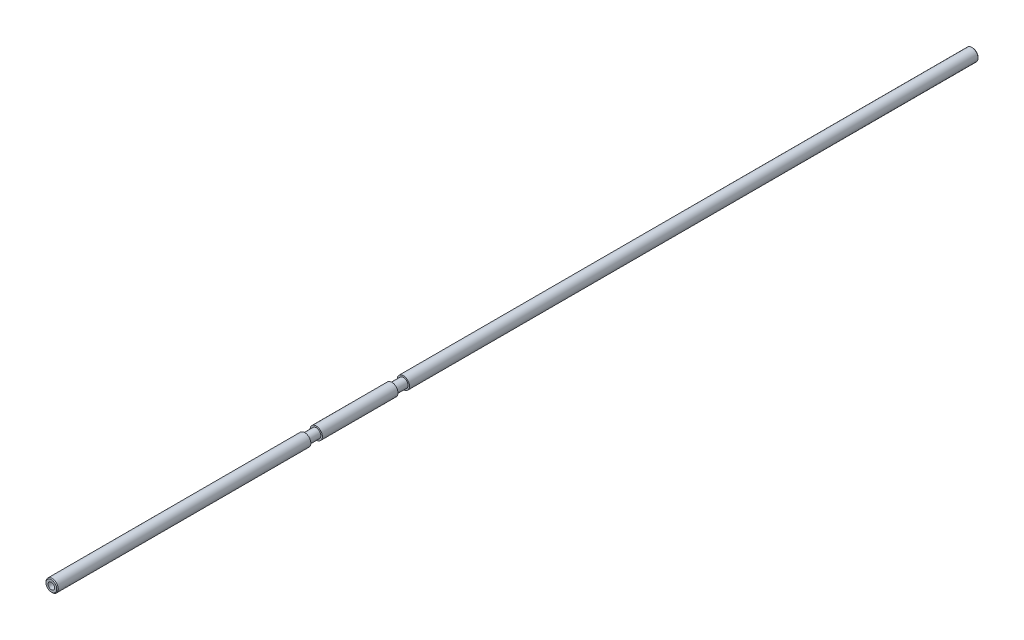
ISO-10303-21;
HEADER;
FILE_DESCRIPTION(('STEP AP214'),'2;1');
FILE_NAME('part.step','',(''),(''),'','','');
FILE_SCHEMA(('AUTOMOTIVE_DESIGN { 1 0 10303 214 1 1 1 1 }'));
ENDSEC;
DATA;
#1=APPLICATION_CONTEXT('core data for automotive mechanical design processes');
#2=APPLICATION_PROTOCOL_DEFINITION('international standard','automotive_design',2000,#1);
#3=PRODUCT_CONTEXT('',#1,'mechanical');
#4=PRODUCT('Part','Part','',(#3));
#5=PRODUCT_RELATED_PRODUCT_CATEGORY('part','',(#4));
#6=PRODUCT_DEFINITION_FORMATION('','',#4);
#7=PRODUCT_DEFINITION_CONTEXT('part definition',#1,'design');
#8=PRODUCT_DEFINITION('design','',#6,#7);
#9=PRODUCT_DEFINITION_SHAPE('','',#8);
#10=(LENGTH_UNIT() NAMED_UNIT(*) SI_UNIT(.MILLI.,.METRE.));
#11=(NAMED_UNIT(*) PLANE_ANGLE_UNIT() SI_UNIT($,.RADIAN.));
#12=(NAMED_UNIT(*) SI_UNIT($,.STERADIAN.) SOLID_ANGLE_UNIT());
#13=UNCERTAINTY_MEASURE_WITH_UNIT(LENGTH_MEASURE(1.E-05),#10,'distance_accuracy_value','');
#14=(GEOMETRIC_REPRESENTATION_CONTEXT(3) GLOBAL_UNCERTAINTY_ASSIGNED_CONTEXT((#13)) GLOBAL_UNIT_ASSIGNED_CONTEXT((#10,
#11,#12)) REPRESENTATION_CONTEXT('',''));
#15=CARTESIAN_POINT('',(0.,0.,0.));
#16=DIRECTION('',(0.,0.,1.));
#17=DIRECTION('',(1.,0.,0.));
#18=AXIS2_PLACEMENT_3D('',#15,#16,#17);
#19=CARTESIAN_POINT('',(-45.,0.,1210.));
#20=DIRECTION('',(0.,0.,-1.));
#21=DIRECTION('',(-1.,0.,0.));
#22=AXIS2_PLACEMENT_3D('',#19,#20,#21);
#23=CYLINDRICAL_SURFACE('',#22,8.);
#24=CARTESIAN_POINT('',(-45.,0.,766.5));
#25=DIRECTION('',(0.,0.,1.));
#26=DIRECTION('',(1.,0.,0.));
#27=AXIS2_PLACEMENT_3D('',#24,#25,#26);
#28=CIRCLE('',#27,8.);
#29=CARTESIAN_POINT('',(-37.,0.,766.5));
#30=VERTEX_POINT('',#29);
#31=EDGE_CURVE('E79',#30,#30,#28,.T.);
#32=ORIENTED_EDGE('',*,*,#31,.T.);
#33=EDGE_LOOP('',(#32));
#34=FACE_BOUND('',#33,.T.);
#35=CARTESIAN_POINT('',(-45.,0.,865.));
#36=DIRECTION('',(0.,0.,1.));
#37=DIRECTION('',(1.,0.,0.));
#38=AXIS2_PLACEMENT_3D('',#35,#36,#37);
#39=CIRCLE('',#38,8.);
#40=CARTESIAN_POINT('',(-37.,0.,865.));
#41=VERTEX_POINT('',#40);
#42=EDGE_CURVE('E88',#41,#41,#39,.T.);
#43=ORIENTED_EDGE('',*,*,#42,.F.);
#44=EDGE_LOOP('',(#43));
#45=FACE_BOUND('',#44,.T.);
#46=ADVANCED_FACE('F45',(#34,#45),#23,.T.);
#47=CARTESIAN_POINT('',(-45.,0.,10.9999999999997));
#48=DIRECTION('',(0.,0.,1.));
#49=DIRECTION('',(1.,0.,0.));
#50=AXIS2_PLACEMENT_3D('',#47,#48,#49);
#51=CIRCLE('',#50,8.);
#52=CARTESIAN_POINT('',(-37.,0.,10.9999999999997));
#53=VERTEX_POINT('',#52);
#54=EDGE_CURVE('E57',#53,#53,#51,.T.);
#55=ORIENTED_EDGE('',*,*,#54,.T.);
#56=EDGE_LOOP('',(#55));
#57=FACE_BOUND('',#56,.T.);
#58=CARTESIAN_POINT('',(-45.,0.,751.5));
#59=DIRECTION('',(0.,0.,1.));
#60=DIRECTION('',(1.,0.,0.));
#61=AXIS2_PLACEMENT_3D('',#58,#59,#60);
#62=CIRCLE('',#61,8.);
#63=CARTESIAN_POINT('',(-37.,0.,751.5));
#64=VERTEX_POINT('',#63);
#65=EDGE_CURVE('E76',#64,#64,#62,.T.);
#66=ORIENTED_EDGE('',*,*,#65,.F.);
#67=EDGE_LOOP('',(#66));
#68=FACE_BOUND('',#67,.T.);
#69=ADVANCED_FACE('F115',(#57,#68),#23,.T.);
#70=CARTESIAN_POINT('',(-45.,0.,10.));
#71=DIRECTION('',(0.,0.,1.));
#72=DIRECTION('',(1.,0.,0.));
#73=AXIS2_PLACEMENT_3D('',#70,#71,#72);
#74=PLANE('',#73);
#75=CARTESIAN_POINT('',(-45.,0.,10.));
#76=DIRECTION('',(0.,0.,-1.));
#77=DIRECTION('',(-1.,0.,0.));
#78=AXIS2_PLACEMENT_3D('',#75,#76,#77);
#79=CIRCLE('',#78,4.25000000000001);
#80=CARTESIAN_POINT('',(-49.25,0.,10.));
#81=VERTEX_POINT('',#80);
#82=EDGE_CURVE('E73',#81,#81,#79,.T.);
#83=ORIENTED_EDGE('',*,*,#82,.F.);
#84=EDGE_LOOP('',(#83));
#85=FACE_BOUND('',#84,.T.);
#86=CARTESIAN_POINT('',(-45.,0.,10.));
#87=DIRECTION('',(0.,0.,1.));
#88=DIRECTION('',(1.,0.,0.));
#89=AXIS2_PLACEMENT_3D('',#86,#87,#88);
#90=CIRCLE('',#89,7.00000000000022);
#91=CARTESIAN_POINT('',(-37.9999999999998,0.,10.));
#92=VERTEX_POINT('',#91);
#93=EDGE_CURVE('E10',#92,#92,#90,.F.);
#94=ORIENTED_EDGE('',*,*,#93,.T.);
#95=EDGE_LOOP('',(#94));
#96=FACE_BOUND('',#95,.T.);
#97=ADVANCED_FACE('F123',(#85,#96),#74,.F.);
#98=CARTESIAN_POINT('',(-45.,0.,10.9999999999997));
#99=DIRECTION('',(0.,0.,1.));
#100=DIRECTION('',(1.,0.,0.));
#101=AXIS2_PLACEMENT_3D('',#98,#99,#100);
#102=CONICAL_SURFACE('',#101,8.,0.785398163397499);
#103=ORIENTED_EDGE('',*,*,#93,.F.);
#104=EDGE_LOOP('',(#103));
#105=FACE_BOUND('',#104,.T.);
#106=ORIENTED_EDGE('',*,*,#54,.F.);
#107=EDGE_LOOP('',(#106));
#108=FACE_BOUND('',#107,.T.);
#109=ADVANCED_FACE('F48',(#105,#108),#102,.T.);
#110=CARTESIAN_POINT('',(-45.,0.,60.));
#111=DIRECTION('',(0.,0.,-1.));
#112=DIRECTION('',(-1.,0.,0.));
#113=AXIS2_PLACEMENT_3D('',#110,#111,#112);
#114=CYLINDRICAL_SURFACE('',#113,4.25000000000001);
#115=CARTESIAN_POINT('',(-45.,0.,60.));
#116=DIRECTION('',(0.,0.,-1.));
#117=DIRECTION('',(-1.,0.,0.));
#118=AXIS2_PLACEMENT_3D('',#115,#116,#117);
#119=CIRCLE('',#118,4.25000000000001);
#120=CARTESIAN_POINT('',(-49.25,0.,60.));
#121=VERTEX_POINT('',#120);
#122=EDGE_CURVE('E70',#121,#121,#119,.T.);
#123=ORIENTED_EDGE('',*,*,#122,.F.);
#124=EDGE_LOOP('',(#123));
#125=FACE_BOUND('',#124,.T.);
#126=ORIENTED_EDGE('',*,*,#82,.T.);
#127=EDGE_LOOP('',(#126));
#128=FACE_BOUND('',#127,.T.);
#129=ADVANCED_FACE('F158',(#125,#128),#114,.F.);
#130=CARTESIAN_POINT('',(-45.,0.,60.));
#131=DIRECTION('',(0.,0.,-1.));
#132=DIRECTION('',(-1.,0.,0.));
#133=AXIS2_PLACEMENT_3D('',#130,#131,#132);
#134=PLANE('',#133);
#135=ORIENTED_EDGE('',*,*,#122,.T.);
#136=EDGE_LOOP('',(#135));
#137=FACE_BOUND('',#136,.T.);
#138=ADVANCED_FACE('F151',(#137),#134,.T.);
#139=CARTESIAN_POINT('',(-45.,0.,751.5));
#140=DIRECTION('',(0.,0.,1.));
#141=DIRECTION('',(1.,0.,0.));
#142=AXIS2_PLACEMENT_3D('',#139,#140,#141);
#143=PLANE('',#142);
#144=CARTESIAN_POINT('',(-45.,0.,751.5));
#145=DIRECTION('',(0.,0.,1.));
#146=DIRECTION('',(1.,0.,0.));
#147=AXIS2_PLACEMENT_3D('',#144,#145,#146);
#148=CIRCLE('',#147,6.);
#149=CARTESIAN_POINT('',(-39.,0.,751.5));
#150=VERTEX_POINT('',#149);
#151=EDGE_CURVE('E82',#150,#150,#148,.T.);
#152=ORIENTED_EDGE('',*,*,#151,.F.);
#153=EDGE_LOOP('',(#152));
#154=FACE_BOUND('',#153,.T.);
#155=ORIENTED_EDGE('',*,*,#65,.T.);
#156=EDGE_LOOP('',(#155));
#157=FACE_BOUND('',#156,.T.);
#158=ADVANCED_FACE('F148',(#154,#157),#143,.T.);
#159=CARTESIAN_POINT('',(-45.,0.,766.5));
#160=DIRECTION('',(0.,0.,1.));
#161=DIRECTION('',(1.,0.,0.));
#162=AXIS2_PLACEMENT_3D('',#159,#160,#161);
#163=PLANE('',#162);
#164=CARTESIAN_POINT('',(-45.,0.,766.5));
#165=DIRECTION('',(0.,0.,1.));
#166=DIRECTION('',(1.,0.,0.));
#167=AXIS2_PLACEMENT_3D('',#164,#165,#166);
#168=CIRCLE('',#167,6.);
#169=CARTESIAN_POINT('',(-39.,0.,766.5));
#170=VERTEX_POINT('',#169);
#171=EDGE_CURVE('E85',#170,#170,#168,.T.);
#172=ORIENTED_EDGE('',*,*,#171,.T.);
#173=EDGE_LOOP('',(#172));
#174=FACE_BOUND('',#173,.T.);
#175=ORIENTED_EDGE('',*,*,#31,.F.);
#176=EDGE_LOOP('',(#175));
#177=FACE_BOUND('',#176,.T.);
#178=ADVANCED_FACE('F146',(#174,#177),#163,.F.);
#179=CARTESIAN_POINT('',(-45.,0.,751.5));
#180=DIRECTION('',(0.,0.,1.));
#181=DIRECTION('',(1.,0.,0.));
#182=AXIS2_PLACEMENT_3D('',#179,#180,#181);
#183=CYLINDRICAL_SURFACE('',#182,6.);
#184=ORIENTED_EDGE('',*,*,#151,.T.);
#185=EDGE_LOOP('',(#184));
#186=FACE_BOUND('',#185,.T.);
#187=ORIENTED_EDGE('',*,*,#171,.F.);
#188=EDGE_LOOP('',(#187));
#189=FACE_BOUND('',#188,.T.);
#190=ADVANCED_FACE('F110',(#186,#189),#183,.T.);
#191=CARTESIAN_POINT('',(-45.,0.,865.));
#192=DIRECTION('',(0.,0.,1.));
#193=DIRECTION('',(1.,0.,0.));
#194=AXIS2_PLACEMENT_3D('',#191,#192,#193);
#195=PLANE('',#194);
#196=CARTESIAN_POINT('',(-45.,0.,865.));
#197=DIRECTION('',(0.,0.,1.));
#198=DIRECTION('',(1.,0.,0.));
#199=AXIS2_PLACEMENT_3D('',#196,#197,#198);
#200=CIRCLE('',#199,6.);
#201=CARTESIAN_POINT('',(-39.,0.,865.));
#202=VERTEX_POINT('',#201);
#203=EDGE_CURVE('E94',#202,#202,#200,.T.);
#204=ORIENTED_EDGE('',*,*,#203,.F.);
#205=EDGE_LOOP('',(#204));
#206=FACE_BOUND('',#205,.T.);
#207=ORIENTED_EDGE('',*,*,#42,.T.);
#208=EDGE_LOOP('',(#207));
#209=FACE_BOUND('',#208,.T.);
#210=ADVANCED_FACE('F106',(#206,#209),#195,.T.);
#211=CARTESIAN_POINT('',(-45.,0.,880.));
#212=DIRECTION('',(0.,0.,1.));
#213=DIRECTION('',(1.,0.,0.));
#214=AXIS2_PLACEMENT_3D('',#211,#212,#213);
#215=PLANE('',#214);
#216=CARTESIAN_POINT('',(-45.,0.,880.));
#217=DIRECTION('',(0.,0.,1.));
#218=DIRECTION('',(1.,0.,0.));
#219=AXIS2_PLACEMENT_3D('',#216,#217,#218);
#220=CIRCLE('',#219,6.);
#221=CARTESIAN_POINT('',(-39.,0.,880.));
#222=VERTEX_POINT('',#221);
#223=EDGE_CURVE('E97',#222,#222,#220,.T.);
#224=ORIENTED_EDGE('',*,*,#223,.T.);
#225=EDGE_LOOP('',(#224));
#226=FACE_BOUND('',#225,.T.);
#227=CARTESIAN_POINT('',(-45.,0.,880.));
#228=DIRECTION('',(0.,0.,1.));
#229=DIRECTION('',(1.,0.,0.));
#230=AXIS2_PLACEMENT_3D('',#227,#228,#229);
#231=CIRCLE('',#230,8.);
#232=CARTESIAN_POINT('',(-37.,0.,880.));
#233=VERTEX_POINT('',#232);
#234=EDGE_CURVE('E91',#233,#233,#231,.T.);
#235=ORIENTED_EDGE('',*,*,#234,.F.);
#236=EDGE_LOOP('',(#235));
#237=FACE_BOUND('',#236,.T.);
#238=ADVANCED_FACE('F109',(#226,#237),#215,.F.);
#239=CARTESIAN_POINT('',(-45.,0.,865.));
#240=DIRECTION('',(0.,0.,1.));
#241=DIRECTION('',(1.,0.,0.));
#242=AXIS2_PLACEMENT_3D('',#239,#240,#241);
#243=CYLINDRICAL_SURFACE('',#242,6.);
#244=ORIENTED_EDGE('',*,*,#203,.T.);
#245=EDGE_LOOP('',(#244));
#246=FACE_BOUND('',#245,.T.);
#247=ORIENTED_EDGE('',*,*,#223,.F.);
#248=EDGE_LOOP('',(#247));
#249=FACE_BOUND('',#248,.T.);
#250=ADVANCED_FACE('F103',(#246,#249),#243,.T.);
#251=CARTESIAN_POINT('',(-45.,0.,1160.));
#252=DIRECTION('',(0.,0.,1.));
#253=DIRECTION('',(1.,0.,0.));
#254=AXIS2_PLACEMENT_3D('',#251,#252,#253);
#255=PLANE('',#254);
#256=CARTESIAN_POINT('',(-45.,0.,1160.));
#257=DIRECTION('',(0.,0.,1.));
#258=DIRECTION('',(1.,0.,0.));
#259=AXIS2_PLACEMENT_3D('',#256,#257,#258);
#260=CIRCLE('',#259,4.25000000000001);
#261=CARTESIAN_POINT('',(-40.75,0.,1160.));
#262=VERTEX_POINT('',#261);
#263=EDGE_CURVE('E66',#262,#262,#260,.T.);
#264=ORIENTED_EDGE('',*,*,#263,.T.);
#265=EDGE_LOOP('',(#264));
#266=FACE_BOUND('',#265,.T.);
#267=ADVANCED_FACE('F142',(#266),#255,.T.);
#268=CARTESIAN_POINT('',(-45.,0.,1160.));
#269=DIRECTION('',(0.,0.,1.));
#270=DIRECTION('',(1.,0.,0.));
#271=AXIS2_PLACEMENT_3D('',#268,#269,#270);
#272=CYLINDRICAL_SURFACE('',#271,4.25000000000001);
#273=ORIENTED_EDGE('',*,*,#263,.F.);
#274=EDGE_LOOP('',(#273));
#275=FACE_BOUND('',#274,.T.);
#276=CARTESIAN_POINT('',(-45.,0.,1210.));
#277=DIRECTION('',(0.,0.,1.));
#278=DIRECTION('',(1.,0.,0.));
#279=AXIS2_PLACEMENT_3D('',#276,#277,#278);
#280=CIRCLE('',#279,4.25000000000001);
#281=CARTESIAN_POINT('',(-40.75,0.,1210.));
#282=VERTEX_POINT('',#281);
#283=EDGE_CURVE('E67',#282,#282,#280,.T.);
#284=ORIENTED_EDGE('',*,*,#283,.T.);
#285=EDGE_LOOP('',(#284));
#286=FACE_BOUND('',#285,.T.);
#287=ADVANCED_FACE('F165',(#275,#286),#272,.F.);
#288=CARTESIAN_POINT('',(-45.,0.,1210.));
#289=DIRECTION('',(0.,0.,1.));
#290=DIRECTION('',(1.,0.,0.));
#291=AXIS2_PLACEMENT_3D('',#288,#289,#290);
#292=PLANE('',#291);
#293=ORIENTED_EDGE('',*,*,#283,.F.);
#294=EDGE_LOOP('',(#293));
#295=FACE_BOUND('',#294,.T.);
#296=CARTESIAN_POINT('',(-45.,0.,1210.));
#297=DIRECTION('',(0.,0.,1.));
#298=DIRECTION('',(1.,0.,0.));
#299=AXIS2_PLACEMENT_3D('',#296,#297,#298);
#300=CIRCLE('',#299,7.00000000000012);
#301=CARTESIAN_POINT('',(-37.9999999999999,0.,1210.));
#302=VERTEX_POINT('',#301);
#303=EDGE_CURVE('E61',#302,#302,#300,.T.);
#304=ORIENTED_EDGE('',*,*,#303,.T.);
#305=EDGE_LOOP('',(#304));
#306=FACE_BOUND('',#305,.T.);
#307=ADVANCED_FACE('F133',(#295,#306),#292,.T.);
#308=CARTESIAN_POINT('',(-45.,0.,1210.));
#309=DIRECTION('',(0.,0.,-1.));
#310=DIRECTION('',(-1.,0.,0.));
#311=AXIS2_PLACEMENT_3D('',#308,#309,#310);
#312=CONICAL_SURFACE('',#311,7.00000000000012,0.785398163397444);
#313=CARTESIAN_POINT('',(-45.,0.,1209.));
#314=DIRECTION('',(0.,0.,1.));
#315=DIRECTION('',(1.,0.,0.));
#316=AXIS2_PLACEMENT_3D('',#313,#314,#315);
#317=CIRCLE('',#316,8.);
#318=CARTESIAN_POINT('',(-37.,0.,1209.));
#319=VERTEX_POINT('',#318);
#320=EDGE_CURVE('E53',#319,#319,#317,.F.);
#321=ORIENTED_EDGE('',*,*,#320,.F.);
#322=EDGE_LOOP('',(#321));
#323=FACE_BOUND('',#322,.T.);
#324=ORIENTED_EDGE('',*,*,#303,.F.);
#325=EDGE_LOOP('',(#324));
#326=FACE_BOUND('',#325,.T.);
#327=ADVANCED_FACE('F127',(#323,#326),#312,.T.);
#328=ORIENTED_EDGE('',*,*,#234,.T.);
#329=EDGE_LOOP('',(#328));
#330=FACE_BOUND('',#329,.T.);
#331=ORIENTED_EDGE('',*,*,#320,.T.);
#332=EDGE_LOOP('',(#331));
#333=FACE_BOUND('',#332,.T.);
#334=ADVANCED_FACE('F118',(#330,#333),#23,.T.);
#335=CLOSED_SHELL('',(#46,#69,#97,#109,#129,#138,#158,#178,#190,#210,#238,#250,#267,#287,#307,
#327,#334));
#336=MANIFOLD_SOLID_BREP('B2',#335);
#337=ADVANCED_BREP_SHAPE_REPRESENTATION('',(#18,#336),#14);
#338=SHAPE_DEFINITION_REPRESENTATION(#9,#337);
ENDSEC;
END-ISO-10303-21;
